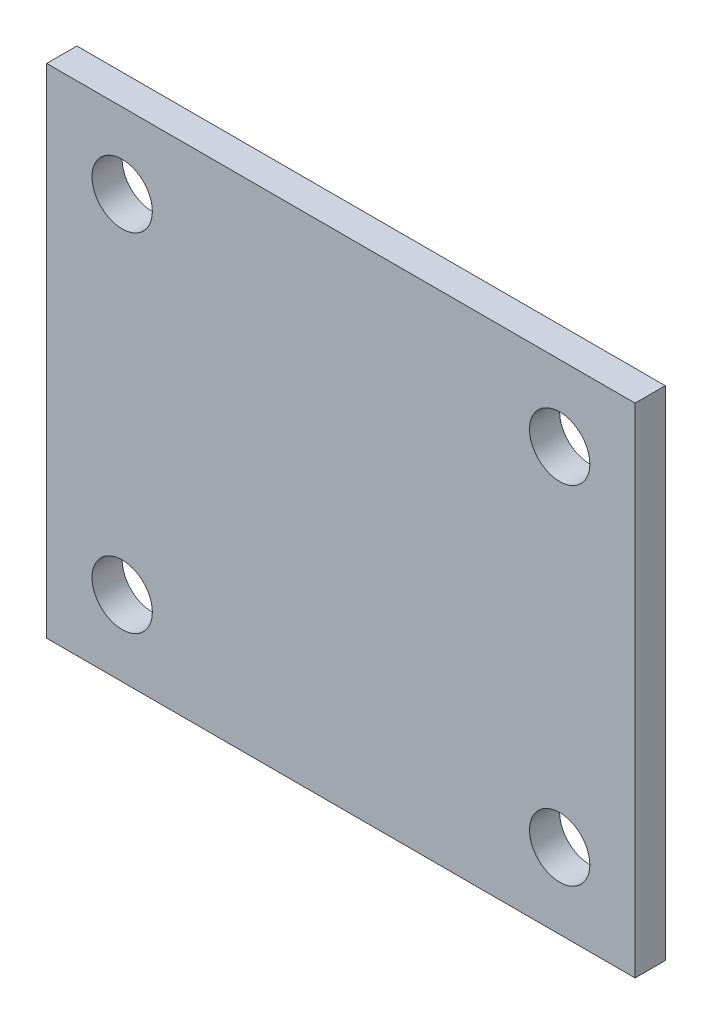
ISO-10303-21;
HEADER;
FILE_DESCRIPTION(('STEP AP214'),'2;1');
FILE_NAME('part.step','',(''),(''),'','','');
FILE_SCHEMA(('AUTOMOTIVE_DESIGN { 1 0 10303 214 1 1 1 1 }'));
ENDSEC;
DATA;
#1=APPLICATION_CONTEXT('core data for automotive mechanical design processes');
#2=APPLICATION_PROTOCOL_DEFINITION('international standard','automotive_design',2000,#1);
#3=PRODUCT_CONTEXT('',#1,'mechanical');
#4=PRODUCT('Part','Part','',(#3));
#5=PRODUCT_RELATED_PRODUCT_CATEGORY('part','',(#4));
#6=PRODUCT_DEFINITION_FORMATION('','',#4);
#7=PRODUCT_DEFINITION_CONTEXT('part definition',#1,'design');
#8=PRODUCT_DEFINITION('design','',#6,#7);
#9=PRODUCT_DEFINITION_SHAPE('','',#8);
#10=(LENGTH_UNIT() NAMED_UNIT(*) SI_UNIT(.MILLI.,.METRE.));
#11=(NAMED_UNIT(*) PLANE_ANGLE_UNIT() SI_UNIT($,.RADIAN.));
#12=(NAMED_UNIT(*) SI_UNIT($,.STERADIAN.) SOLID_ANGLE_UNIT());
#13=UNCERTAINTY_MEASURE_WITH_UNIT(LENGTH_MEASURE(1.E-05),#10,'distance_accuracy_value','');
#14=(GEOMETRIC_REPRESENTATION_CONTEXT(3) GLOBAL_UNCERTAINTY_ASSIGNED_CONTEXT((#13)) GLOBAL_UNIT_ASSIGNED_CONTEXT((#10,
#11,#12)) REPRESENTATION_CONTEXT('',''));
#15=CARTESIAN_POINT('',(0.,0.,0.));
#16=DIRECTION('',(0.,0.,1.));
#17=DIRECTION('',(1.,0.,0.));
#18=AXIS2_PLACEMENT_3D('',#15,#16,#17);
#19=CARTESIAN_POINT('',(0.,0.,2.));
#20=DIRECTION('',(0.,0.,1.));
#21=DIRECTION('',(1.,0.,0.));
#22=AXIS2_PLACEMENT_3D('',#19,#20,#21);
#23=PLANE('',#22);
#24=CARTESIAN_POINT('',(14.5,-11.5,2.));
#25=DIRECTION('',(0.,0.,1.));
#26=DIRECTION('',(1.,0.,0.));
#27=AXIS2_PLACEMENT_3D('',#24,#25,#26);
#28=CIRCLE('',#27,2.);
#29=CARTESIAN_POINT('',(16.5,-11.5,2.));
#30=VERTEX_POINT('',#29);
#31=EDGE_CURVE('E120',#30,#30,#28,.T.);
#32=ORIENTED_EDGE('',*,*,#31,.F.);
#33=EDGE_LOOP('',(#32));
#34=FACE_BOUND('',#33,.T.);
#35=CARTESIAN_POINT('',(-14.5,11.5,2.));
#36=DIRECTION('',(0.,0.,1.));
#37=DIRECTION('',(1.,0.,0.));
#38=AXIS2_PLACEMENT_3D('',#35,#36,#37);
#39=CIRCLE('',#38,2.);
#40=CARTESIAN_POINT('',(-12.5,11.5,2.));
#41=VERTEX_POINT('',#40);
#42=EDGE_CURVE('E99',#41,#41,#39,.T.);
#43=ORIENTED_EDGE('',*,*,#42,.F.);
#44=EDGE_LOOP('',(#43));
#45=FACE_BOUND('',#44,.T.);
#46=DIRECTION('',(0.,1.,0.));
#47=VECTOR('',#46,1.);
#48=CARTESIAN_POINT('',(19.5,16.5,2.));
#49=LINE('',#48,#47);
#50=CARTESIAN_POINT('',(19.5,-16.5,2.));
#51=VERTEX_POINT('',#50);
#52=CARTESIAN_POINT('',(19.5,16.5,2.));
#53=VERTEX_POINT('',#52);
#54=EDGE_CURVE('E84',#51,#53,#49,.T.);
#55=ORIENTED_EDGE('',*,*,#54,.T.);
#56=DIRECTION('',(-1.,0.,0.));
#57=VECTOR('',#56,1.);
#58=CARTESIAN_POINT('',(-19.5,16.5,2.));
#59=LINE('',#58,#57);
#60=CARTESIAN_POINT('',(-19.5,16.5,2.));
#61=VERTEX_POINT('',#60);
#62=EDGE_CURVE('E79',#53,#61,#59,.T.);
#63=ORIENTED_EDGE('',*,*,#62,.T.);
#64=DIRECTION('',(0.,-1.,0.));
#65=VECTOR('',#64,1.);
#66=CARTESIAN_POINT('',(-19.5,16.5,2.));
#67=LINE('',#66,#65);
#68=CARTESIAN_POINT('',(-19.5,-16.5,2.));
#69=VERTEX_POINT('',#68);
#70=EDGE_CURVE('E82',#61,#69,#67,.T.);
#71=ORIENTED_EDGE('',*,*,#70,.T.);
#72=DIRECTION('',(1.,0.,0.));
#73=VECTOR('',#72,1.);
#74=CARTESIAN_POINT('',(-19.5,-16.5,2.));
#75=LINE('',#74,#73);
#76=EDGE_CURVE('E49',#69,#51,#75,.T.);
#77=ORIENTED_EDGE('',*,*,#76,.T.);
#78=EDGE_LOOP('',(#55,#63,#71,#77));
#79=FACE_BOUND('',#78,.T.);
#80=CARTESIAN_POINT('',(-14.5,-11.5,2.));
#81=DIRECTION('',(0.,0.,1.));
#82=DIRECTION('',(1.,0.,0.));
#83=AXIS2_PLACEMENT_3D('',#80,#81,#82);
#84=CIRCLE('',#83,2.);
#85=CARTESIAN_POINT('',(-12.5,-11.5,2.));
#86=VERTEX_POINT('',#85);
#87=EDGE_CURVE('E114',#86,#86,#84,.T.);
#88=ORIENTED_EDGE('',*,*,#87,.F.);
#89=EDGE_LOOP('',(#88));
#90=FACE_BOUND('',#89,.T.);
#91=CARTESIAN_POINT('',(14.5,11.5,2.));
#92=DIRECTION('',(0.,0.,1.));
#93=DIRECTION('',(1.,0.,0.));
#94=AXIS2_PLACEMENT_3D('',#91,#92,#93);
#95=CIRCLE('',#94,2.);
#96=CARTESIAN_POINT('',(16.5,11.5,2.));
#97=VERTEX_POINT('',#96);
#98=EDGE_CURVE('E126',#97,#97,#95,.T.);
#99=ORIENTED_EDGE('',*,*,#98,.F.);
#100=EDGE_LOOP('',(#99));
#101=FACE_BOUND('',#100,.T.);
#102=ADVANCED_FACE('F32',(#34,#45,#79,#90,#101),#23,.T.);
#103=CARTESIAN_POINT('',(0.,0.,0.));
#104=DIRECTION('',(0.,0.,1.));
#105=DIRECTION('',(1.,0.,0.));
#106=AXIS2_PLACEMENT_3D('',#103,#104,#105);
#107=PLANE('',#106);
#108=DIRECTION('',(0.,1.,0.));
#109=VECTOR('',#108,1.);
#110=CARTESIAN_POINT('',(19.5,16.5,0.));
#111=LINE('',#110,#109);
#112=CARTESIAN_POINT('',(19.5,-16.5,0.));
#113=VERTEX_POINT('',#112);
#114=CARTESIAN_POINT('',(19.5,16.5,0.));
#115=VERTEX_POINT('',#114);
#116=EDGE_CURVE('E96',#113,#115,#111,.T.);
#117=ORIENTED_EDGE('',*,*,#116,.F.);
#118=DIRECTION('',(1.,0.,0.));
#119=VECTOR('',#118,1.);
#120=CARTESIAN_POINT('',(-19.5,-16.5,0.));
#121=LINE('',#120,#119);
#122=CARTESIAN_POINT('',(-19.5,-16.5,0.));
#123=VERTEX_POINT('',#122);
#124=EDGE_CURVE('E72',#123,#113,#121,.T.);
#125=ORIENTED_EDGE('',*,*,#124,.F.);
#126=DIRECTION('',(0.,-1.,0.));
#127=VECTOR('',#126,1.);
#128=CARTESIAN_POINT('',(-19.5,16.5,0.));
#129=LINE('',#128,#127);
#130=CARTESIAN_POINT('',(-19.5,16.5,0.));
#131=VERTEX_POINT('',#130);
#132=EDGE_CURVE('E66',#131,#123,#129,.T.);
#133=ORIENTED_EDGE('',*,*,#132,.F.);
#134=DIRECTION('',(-1.,0.,0.));
#135=VECTOR('',#134,1.);
#136=CARTESIAN_POINT('',(-19.5,16.5,0.));
#137=LINE('',#136,#135);
#138=EDGE_CURVE('E88',#115,#131,#137,.T.);
#139=ORIENTED_EDGE('',*,*,#138,.F.);
#140=EDGE_LOOP('',(#117,#125,#133,#139));
#141=FACE_BOUND('',#140,.T.);
#142=CARTESIAN_POINT('',(-14.5,11.5,0.));
#143=DIRECTION('',(0.,0.,1.));
#144=DIRECTION('',(1.,0.,0.));
#145=AXIS2_PLACEMENT_3D('',#142,#143,#144);
#146=CIRCLE('',#145,2.);
#147=CARTESIAN_POINT('',(-12.5,11.5,0.));
#148=VERTEX_POINT('',#147);
#149=EDGE_CURVE('E111',#148,#148,#146,.T.);
#150=ORIENTED_EDGE('',*,*,#149,.T.);
#151=EDGE_LOOP('',(#150));
#152=FACE_BOUND('',#151,.T.);
#153=CARTESIAN_POINT('',(-14.5,-11.5,0.));
#154=DIRECTION('',(0.,0.,1.));
#155=DIRECTION('',(1.,0.,0.));
#156=AXIS2_PLACEMENT_3D('',#153,#154,#155);
#157=CIRCLE('',#156,2.);
#158=CARTESIAN_POINT('',(-12.5,-11.5,0.));
#159=VERTEX_POINT('',#158);
#160=EDGE_CURVE('E117',#159,#159,#157,.T.);
#161=ORIENTED_EDGE('',*,*,#160,.T.);
#162=EDGE_LOOP('',(#161));
#163=FACE_BOUND('',#162,.T.);
#164=CARTESIAN_POINT('',(14.5,-11.5,0.));
#165=DIRECTION('',(0.,0.,1.));
#166=DIRECTION('',(1.,0.,0.));
#167=AXIS2_PLACEMENT_3D('',#164,#165,#166);
#168=CIRCLE('',#167,2.);
#169=CARTESIAN_POINT('',(16.5,-11.5,0.));
#170=VERTEX_POINT('',#169);
#171=EDGE_CURVE('E123',#170,#170,#168,.T.);
#172=ORIENTED_EDGE('',*,*,#171,.T.);
#173=EDGE_LOOP('',(#172));
#174=FACE_BOUND('',#173,.T.);
#175=CARTESIAN_POINT('',(14.5,11.5,0.));
#176=DIRECTION('',(0.,0.,1.));
#177=DIRECTION('',(1.,0.,0.));
#178=AXIS2_PLACEMENT_3D('',#175,#176,#177);
#179=CIRCLE('',#178,2.);
#180=CARTESIAN_POINT('',(16.5,11.5,0.));
#181=VERTEX_POINT('',#180);
#182=EDGE_CURVE('E129',#181,#181,#179,.T.);
#183=ORIENTED_EDGE('',*,*,#182,.T.);
#184=EDGE_LOOP('',(#183));
#185=FACE_BOUND('',#184,.T.);
#186=ADVANCED_FACE('F107',(#141,#152,#163,#174,#185),#107,.F.);
#187=CARTESIAN_POINT('',(19.5,16.5,2.));
#188=DIRECTION('',(-1.,0.,0.));
#189=DIRECTION('',(0.,0.,1.));
#190=AXIS2_PLACEMENT_3D('',#187,#188,#189);
#191=PLANE('',#190);
#192=ORIENTED_EDGE('',*,*,#116,.T.);
#193=DIRECTION('',(0.,0.,-1.));
#194=VECTOR('',#193,1.);
#195=CARTESIAN_POINT('',(19.5,16.5,2.));
#196=LINE('',#195,#194);
#197=EDGE_CURVE('E11',#53,#115,#196,.T.);
#198=ORIENTED_EDGE('',*,*,#197,.F.);
#199=ORIENTED_EDGE('',*,*,#54,.F.);
#200=DIRECTION('',(0.,0.,-1.));
#201=VECTOR('',#200,1.);
#202=CARTESIAN_POINT('',(19.5,-16.5,2.));
#203=LINE('',#202,#201);
#204=EDGE_CURVE('E92',#51,#113,#203,.T.);
#205=ORIENTED_EDGE('',*,*,#204,.T.);
#206=EDGE_LOOP('',(#192,#198,#199,#205));
#207=FACE_BOUND('',#206,.T.);
#208=ADVANCED_FACE('F34',(#207),#191,.F.);
#209=CARTESIAN_POINT('',(-19.5,16.5,2.));
#210=DIRECTION('',(0.,-1.,0.));
#211=DIRECTION('',(0.,0.,-1.));
#212=AXIS2_PLACEMENT_3D('',#209,#210,#211);
#213=PLANE('',#212);
#214=ORIENTED_EDGE('',*,*,#138,.T.);
#215=DIRECTION('',(0.,0.,-1.));
#216=VECTOR('',#215,1.);
#217=CARTESIAN_POINT('',(-19.5,16.5,2.));
#218=LINE('',#217,#216);
#219=EDGE_CURVE('E41',#61,#131,#218,.T.);
#220=ORIENTED_EDGE('',*,*,#219,.F.);
#221=ORIENTED_EDGE('',*,*,#62,.F.);
#222=ORIENTED_EDGE('',*,*,#197,.T.);
#223=EDGE_LOOP('',(#214,#220,#221,#222));
#224=FACE_BOUND('',#223,.T.);
#225=ADVANCED_FACE('F87',(#224),#213,.F.);
#226=CARTESIAN_POINT('',(-19.5,16.5,2.));
#227=DIRECTION('',(1.,0.,0.));
#228=DIRECTION('',(0.,0.,-1.));
#229=AXIS2_PLACEMENT_3D('',#226,#227,#228);
#230=PLANE('',#229);
#231=ORIENTED_EDGE('',*,*,#132,.T.);
#232=DIRECTION('',(0.,0.,-1.));
#233=VECTOR('',#232,1.);
#234=CARTESIAN_POINT('',(-19.5,-16.5,2.));
#235=LINE('',#234,#233);
#236=EDGE_CURVE('E89',#69,#123,#235,.T.);
#237=ORIENTED_EDGE('',*,*,#236,.F.);
#238=ORIENTED_EDGE('',*,*,#70,.F.);
#239=ORIENTED_EDGE('',*,*,#219,.T.);
#240=EDGE_LOOP('',(#231,#237,#238,#239));
#241=FACE_BOUND('',#240,.T.);
#242=ADVANCED_FACE('F90',(#241),#230,.F.);
#243=CARTESIAN_POINT('',(-19.5,-16.5,2.));
#244=DIRECTION('',(0.,1.,0.));
#245=DIRECTION('',(0.,0.,1.));
#246=AXIS2_PLACEMENT_3D('',#243,#244,#245);
#247=PLANE('',#246);
#248=ORIENTED_EDGE('',*,*,#124,.T.);
#249=ORIENTED_EDGE('',*,*,#204,.F.);
#250=ORIENTED_EDGE('',*,*,#76,.F.);
#251=ORIENTED_EDGE('',*,*,#236,.T.);
#252=EDGE_LOOP('',(#248,#249,#250,#251));
#253=FACE_BOUND('',#252,.T.);
#254=ADVANCED_FACE('F104',(#253),#247,.F.);
#255=CARTESIAN_POINT('',(-14.5,11.5,2.));
#256=DIRECTION('',(0.,0.,-1.));
#257=DIRECTION('',(-1.,0.,0.));
#258=AXIS2_PLACEMENT_3D('',#255,#256,#257);
#259=CYLINDRICAL_SURFACE('',#258,2.);
#260=ORIENTED_EDGE('',*,*,#42,.T.);
#261=EDGE_LOOP('',(#260));
#262=FACE_BOUND('',#261,.T.);
#263=ORIENTED_EDGE('',*,*,#149,.F.);
#264=EDGE_LOOP('',(#263));
#265=FACE_BOUND('',#264,.T.);
#266=ADVANCED_FACE('F148',(#262,#265),#259,.F.);
#267=CARTESIAN_POINT('',(-14.5,-11.5,2.));
#268=DIRECTION('',(0.,0.,-1.));
#269=DIRECTION('',(-1.,0.,0.));
#270=AXIS2_PLACEMENT_3D('',#267,#268,#269);
#271=CYLINDRICAL_SURFACE('',#270,2.);
#272=ORIENTED_EDGE('',*,*,#87,.T.);
#273=EDGE_LOOP('',(#272));
#274=FACE_BOUND('',#273,.T.);
#275=ORIENTED_EDGE('',*,*,#160,.F.);
#276=EDGE_LOOP('',(#275));
#277=FACE_BOUND('',#276,.T.);
#278=ADVANCED_FACE('F194',(#274,#277),#271,.F.);
#279=CARTESIAN_POINT('',(14.5,-11.5,2.));
#280=DIRECTION('',(0.,0.,-1.));
#281=DIRECTION('',(-1.,0.,0.));
#282=AXIS2_PLACEMENT_3D('',#279,#280,#281);
#283=CYLINDRICAL_SURFACE('',#282,2.);
#284=ORIENTED_EDGE('',*,*,#31,.T.);
#285=EDGE_LOOP('',(#284));
#286=FACE_BOUND('',#285,.T.);
#287=ORIENTED_EDGE('',*,*,#171,.F.);
#288=EDGE_LOOP('',(#287));
#289=FACE_BOUND('',#288,.T.);
#290=ADVANCED_FACE('F202',(#286,#289),#283,.F.);
#291=CARTESIAN_POINT('',(14.5,11.5,2.));
#292=DIRECTION('',(0.,0.,-1.));
#293=DIRECTION('',(-1.,0.,0.));
#294=AXIS2_PLACEMENT_3D('',#291,#292,#293);
#295=CYLINDRICAL_SURFACE('',#294,2.);
#296=ORIENTED_EDGE('',*,*,#98,.T.);
#297=EDGE_LOOP('',(#296));
#298=FACE_BOUND('',#297,.T.);
#299=ORIENTED_EDGE('',*,*,#182,.F.);
#300=EDGE_LOOP('',(#299));
#301=FACE_BOUND('',#300,.T.);
#302=ADVANCED_FACE('F135',(#298,#301),#295,.F.);
#303=CLOSED_SHELL('',(#102,#186,#208,#225,#242,#254,#266,#278,#290,#302));
#304=MANIFOLD_SOLID_BREP('B2',#303);
#305=ADVANCED_BREP_SHAPE_REPRESENTATION('',(#18,#304),#14);
#306=SHAPE_DEFINITION_REPRESENTATION(#9,#305);
ENDSEC;
END-ISO-10303-21;
